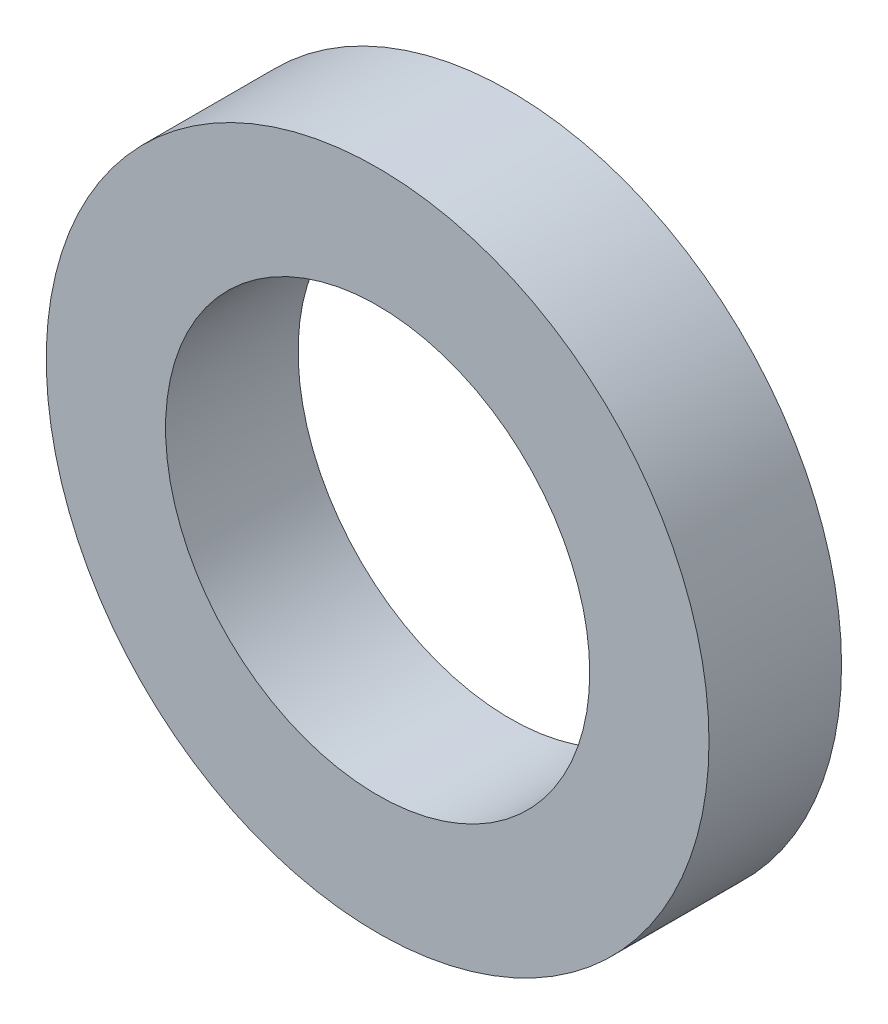
ISO-10303-21;
HEADER;
FILE_DESCRIPTION(('STEP AP214'),'2;1');
FILE_NAME('part.step','',(''),(''),'','','');
FILE_SCHEMA(('AUTOMOTIVE_DESIGN { 1 0 10303 214 1 1 1 1 }'));
ENDSEC;
DATA;
#1=APPLICATION_CONTEXT('core data for automotive mechanical design processes');
#2=APPLICATION_PROTOCOL_DEFINITION('international standard','automotive_design',2000,#1);
#3=PRODUCT_CONTEXT('',#1,'mechanical');
#4=PRODUCT('Part','Part','',(#3));
#5=PRODUCT_RELATED_PRODUCT_CATEGORY('part','',(#4));
#6=PRODUCT_DEFINITION_FORMATION('','',#4);
#7=PRODUCT_DEFINITION_CONTEXT('part definition',#1,'design');
#8=PRODUCT_DEFINITION('design','',#6,#7);
#9=PRODUCT_DEFINITION_SHAPE('','',#8);
#10=(LENGTH_UNIT() NAMED_UNIT(*) SI_UNIT(.MILLI.,.METRE.));
#11=(NAMED_UNIT(*) PLANE_ANGLE_UNIT() SI_UNIT($,.RADIAN.));
#12=(NAMED_UNIT(*) SI_UNIT($,.STERADIAN.) SOLID_ANGLE_UNIT());
#13=UNCERTAINTY_MEASURE_WITH_UNIT(LENGTH_MEASURE(1.E-05),#10,'distance_accuracy_value','');
#14=(GEOMETRIC_REPRESENTATION_CONTEXT(3) GLOBAL_UNCERTAINTY_ASSIGNED_CONTEXT((#13)) GLOBAL_UNIT_ASSIGNED_CONTEXT((#10,
#11,#12)) REPRESENTATION_CONTEXT('',''));
#15=CARTESIAN_POINT('',(0.,0.,0.));
#16=DIRECTION('',(0.,0.,1.));
#17=DIRECTION('',(1.,0.,0.));
#18=AXIS2_PLACEMENT_3D('',#15,#16,#17);
#19=CARTESIAN_POINT('',(0.,0.,1.));
#20=DIRECTION('',(0.,0.,1.));
#21=DIRECTION('',(1.,0.,0.));
#22=AXIS2_PLACEMENT_3D('',#19,#20,#21);
#23=PLANE('',#22);
#24=CARTESIAN_POINT('',(0.,0.,1.));
#25=DIRECTION('',(0.,0.,1.));
#26=DIRECTION('',(1.,0.,0.));
#27=AXIS2_PLACEMENT_3D('',#24,#25,#26);
#28=CIRCLE('',#27,2.5);
#29=CARTESIAN_POINT('',(2.5,0.,1.));
#30=VERTEX_POINT('',#29);
#31=EDGE_CURVE('E10',#30,#30,#28,.T.);
#32=ORIENTED_EDGE('',*,*,#31,.T.);
#33=EDGE_LOOP('',(#32));
#34=FACE_BOUND('',#33,.T.);
#35=CARTESIAN_POINT('',(0.,0.,1.));
#36=DIRECTION('',(0.,0.,1.));
#37=DIRECTION('',(1.,0.,0.));
#38=AXIS2_PLACEMENT_3D('',#35,#36,#37);
#39=CIRCLE('',#38,1.6);
#40=CARTESIAN_POINT('',(1.6,0.,1.));
#41=VERTEX_POINT('',#40);
#42=EDGE_CURVE('E50',#41,#41,#39,.T.);
#43=ORIENTED_EDGE('',*,*,#42,.F.);
#44=EDGE_LOOP('',(#43));
#45=FACE_BOUND('',#44,.T.);
#46=ADVANCED_FACE('F37',(#34,#45),#23,.T.);
#47=CARTESIAN_POINT('',(0.,0.,0.));
#48=DIRECTION('',(0.,0.,1.));
#49=DIRECTION('',(1.,0.,0.));
#50=AXIS2_PLACEMENT_3D('',#47,#48,#49);
#51=PLANE('',#50);
#52=CARTESIAN_POINT('',(0.,0.,0.));
#53=DIRECTION('',(0.,0.,1.));
#54=DIRECTION('',(1.,0.,0.));
#55=AXIS2_PLACEMENT_3D('',#52,#53,#54);
#56=CIRCLE('',#55,2.5);
#57=CARTESIAN_POINT('',(2.5,0.,0.));
#58=VERTEX_POINT('',#57);
#59=EDGE_CURVE('E41',#58,#58,#56,.T.);
#60=ORIENTED_EDGE('',*,*,#59,.F.);
#61=EDGE_LOOP('',(#60));
#62=FACE_BOUND('',#61,.T.);
#63=CARTESIAN_POINT('',(0.,0.,0.));
#64=DIRECTION('',(0.,0.,1.));
#65=DIRECTION('',(1.,0.,0.));
#66=AXIS2_PLACEMENT_3D('',#63,#64,#65);
#67=CIRCLE('',#66,1.6);
#68=CARTESIAN_POINT('',(1.6,0.,0.));
#69=VERTEX_POINT('',#68);
#70=EDGE_CURVE('E52',#69,#69,#67,.T.);
#71=ORIENTED_EDGE('',*,*,#70,.T.);
#72=EDGE_LOOP('',(#71));
#73=FACE_BOUND('',#72,.T.);
#74=ADVANCED_FACE('F64',(#62,#73),#51,.F.);
#75=CARTESIAN_POINT('',(0.,0.,1.));
#76=DIRECTION('',(0.,0.,-1.));
#77=DIRECTION('',(-1.,0.,0.));
#78=AXIS2_PLACEMENT_3D('',#75,#76,#77);
#79=CYLINDRICAL_SURFACE('',#78,2.5);
#80=ORIENTED_EDGE('',*,*,#31,.F.);
#81=EDGE_LOOP('',(#80));
#82=FACE_BOUND('',#81,.T.);
#83=ORIENTED_EDGE('',*,*,#59,.T.);
#84=EDGE_LOOP('',(#83));
#85=FACE_BOUND('',#84,.T.);
#86=ADVANCED_FACE('F39',(#82,#85),#79,.T.);
#87=CARTESIAN_POINT('',(0.,0.,1.));
#88=DIRECTION('',(0.,0.,-1.));
#89=DIRECTION('',(-1.,0.,0.));
#90=AXIS2_PLACEMENT_3D('',#87,#88,#89);
#91=CYLINDRICAL_SURFACE('',#90,1.6);
#92=ORIENTED_EDGE('',*,*,#42,.T.);
#93=EDGE_LOOP('',(#92));
#94=FACE_BOUND('',#93,.T.);
#95=ORIENTED_EDGE('',*,*,#70,.F.);
#96=EDGE_LOOP('',(#95));
#97=FACE_BOUND('',#96,.T.);
#98=ADVANCED_FACE('F60',(#94,#97),#91,.F.);
#99=CLOSED_SHELL('',(#46,#74,#86,#98));
#100=MANIFOLD_SOLID_BREP('B2',#99);
#101=ADVANCED_BREP_SHAPE_REPRESENTATION('',(#18,#100),#14);
#102=SHAPE_DEFINITION_REPRESENTATION(#9,#101);
ENDSEC;
END-ISO-10303-21;
